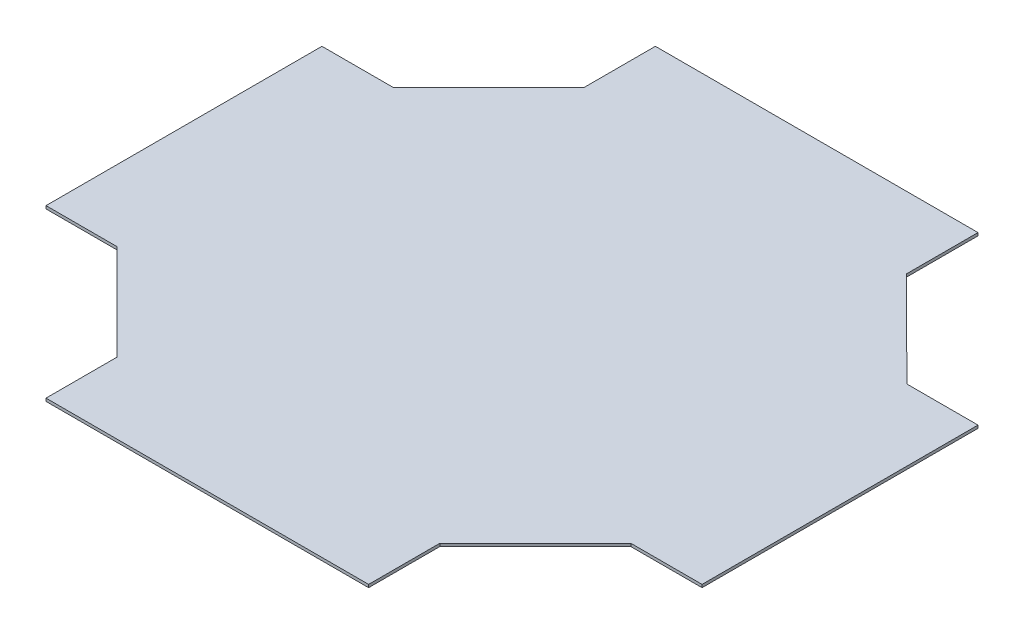
ISO-10303-21;
HEADER;
FILE_DESCRIPTION(('STEP AP214'),'2;1');
FILE_NAME('part.step','',(''),(''),'','','');
FILE_SCHEMA(('AUTOMOTIVE_DESIGN { 1 0 10303 214 1 1 1 1 }'));
ENDSEC;
DATA;
#1=APPLICATION_CONTEXT('core data for automotive mechanical design processes');
#2=APPLICATION_PROTOCOL_DEFINITION('international standard','automotive_design',2000,#1);
#3=PRODUCT_CONTEXT('',#1,'mechanical');
#4=PRODUCT('Part','Part','',(#3));
#5=PRODUCT_RELATED_PRODUCT_CATEGORY('part','',(#4));
#6=PRODUCT_DEFINITION_FORMATION('','',#4);
#7=PRODUCT_DEFINITION_CONTEXT('part definition',#1,'design');
#8=PRODUCT_DEFINITION('design','',#6,#7);
#9=PRODUCT_DEFINITION_SHAPE('','',#8);
#10=(LENGTH_UNIT() NAMED_UNIT(*) SI_UNIT(.MILLI.,.METRE.));
#11=(NAMED_UNIT(*) PLANE_ANGLE_UNIT() SI_UNIT($,.RADIAN.));
#12=(NAMED_UNIT(*) SI_UNIT($,.STERADIAN.) SOLID_ANGLE_UNIT());
#13=UNCERTAINTY_MEASURE_WITH_UNIT(LENGTH_MEASURE(1.E-05),#10,'distance_accuracy_value','');
#14=(GEOMETRIC_REPRESENTATION_CONTEXT(3) GLOBAL_UNCERTAINTY_ASSIGNED_CONTEXT((#13)) GLOBAL_UNIT_ASSIGNED_CONTEXT((#10,
#11,#12)) REPRESENTATION_CONTEXT('',''));
#15=CARTESIAN_POINT('',(0.,0.,0.));
#16=DIRECTION('',(0.,0.,1.));
#17=DIRECTION('',(1.,0.,0.));
#18=AXIS2_PLACEMENT_3D('',#15,#16,#17);
#19=CARTESIAN_POINT('',(9.12317571715341E-13,3.175,294.090177584952));
#20=DIRECTION('',(0.,0.,-1.));
#21=DIRECTION('',(-1.,0.,0.));
#22=AXIS2_PLACEMENT_3D('',#19,#20,#21);
#23=PLANE('',#22);
#24=DIRECTION('',(1.,0.,0.));
#25=VECTOR('',#24,1.);
#26=CARTESIAN_POINT('',(9.12317571715341E-13,0.,294.090177584952));
#27=LINE('',#26,#25);
#28=CARTESIAN_POINT('',(-61.1253312589233,0.,294.090177584952));
#29=VERTEX_POINT('',#28);
#30=CARTESIAN_POINT('',(295.236668741077,0.,294.090177584952));
#31=VERTEX_POINT('',#30);
#32=EDGE_CURVE('E178',#29,#31,#27,.T.);
#33=ORIENTED_EDGE('',*,*,#32,.T.);
#34=DIRECTION('',(0.,-1.,0.));
#35=VECTOR('',#34,1.);
#36=CARTESIAN_POINT('',(295.236668741077,3.175,294.090177584952));
#37=LINE('',#36,#35);
#38=CARTESIAN_POINT('',(295.236668741077,3.175,294.090177584952));
#39=VERTEX_POINT('',#38);
#40=EDGE_CURVE('E11',#39,#31,#37,.T.);
#41=ORIENTED_EDGE('',*,*,#40,.F.);
#42=DIRECTION('',(1.,0.,0.));
#43=VECTOR('',#42,1.);
#44=CARTESIAN_POINT('',(9.12317571715341E-13,3.175,294.090177584952));
#45=LINE('',#44,#43);
#46=CARTESIAN_POINT('',(-61.1253312589233,3.175,294.090177584952));
#47=VERTEX_POINT('',#46);
#48=EDGE_CURVE('E115',#47,#39,#45,.T.);
#49=ORIENTED_EDGE('',*,*,#48,.F.);
#50=DIRECTION('',(0.,-1.,0.));
#51=VECTOR('',#50,1.);
#52=CARTESIAN_POINT('',(-61.1253312589233,3.175,294.090177584952));
#53=LINE('',#52,#51);
#54=EDGE_CURVE('E174',#47,#29,#53,.T.);
#55=ORIENTED_EDGE('',*,*,#54,.T.);
#56=EDGE_LOOP('',(#33,#41,#49,#55));
#57=FACE_BOUND('',#56,.T.);
#58=ADVANCED_FACE('F35',(#57),#23,.F.);
#59=CARTESIAN_POINT('',(295.236668741077,3.175,0.));
#60=DIRECTION('',(1.,0.,0.));
#61=DIRECTION('',(0.,0.,-1.));
#62=AXIS2_PLACEMENT_3D('',#59,#60,#61);
#63=PLANE('',#62);
#64=DIRECTION('',(0.,0.,1.));
#65=VECTOR('',#64,1.);
#66=CARTESIAN_POINT('',(295.236668741077,0.,0.));
#67=LINE('',#66,#65);
#68=CARTESIAN_POINT('',(295.236668741077,0.,215.494659836284));
#69=VERTEX_POINT('',#68);
#70=EDGE_CURVE('E181',#69,#31,#67,.T.);
#71=ORIENTED_EDGE('',*,*,#70,.F.);
#72=DIRECTION('',(0.,-1.,0.));
#73=VECTOR('',#72,1.);
#74=CARTESIAN_POINT('',(295.236668741077,3.175,215.494659836284));
#75=LINE('',#74,#73);
#76=CARTESIAN_POINT('',(295.236668741077,3.175,215.494659836284));
#77=VERTEX_POINT('',#76);
#78=EDGE_CURVE('E43',#77,#69,#75,.T.);
#79=ORIENTED_EDGE('',*,*,#78,.F.);
#80=DIRECTION('',(0.,0.,1.));
#81=VECTOR('',#80,1.);
#82=CARTESIAN_POINT('',(295.236668741077,3.175,0.));
#83=LINE('',#82,#81);
#84=EDGE_CURVE('E265',#77,#39,#83,.T.);
#85=ORIENTED_EDGE('',*,*,#84,.T.);
#86=ORIENTED_EDGE('',*,*,#40,.T.);
#87=EDGE_LOOP('',(#71,#79,#85,#86));
#88=FACE_BOUND('',#87,.T.);
#89=ADVANCED_FACE('F251',(#88),#63,.T.);
#90=CARTESIAN_POINT('',(255.365664288677,3.175,255.365664288683));
#91=DIRECTION('',(0.707106781186539,0.,0.707106781186556));
#92=DIRECTION('',(0.707106781186556,0.,-0.707106781186539));
#93=AXIS2_PLACEMENT_3D('',#90,#91,#92);
#94=PLANE('',#93);
#95=DIRECTION('',(-0.707106781186556,0.,0.707106781186539));
#96=VECTOR('',#95,1.);
#97=CARTESIAN_POINT('',(255.365664288677,0.,255.365664288683));
#98=LINE('',#97,#96);
#99=CARTESIAN_POINT('',(400.791150992411,0.,109.940177584953));
#100=VERTEX_POINT('',#99);
#101=EDGE_CURVE('E184',#100,#69,#98,.T.);
#102=ORIENTED_EDGE('',*,*,#101,.F.);
#103=DIRECTION('',(0.,-1.,0.));
#104=VECTOR('',#103,1.);
#105=CARTESIAN_POINT('',(400.791150992411,3.175,109.940177584953));
#106=LINE('',#105,#104);
#107=CARTESIAN_POINT('',(400.791150992411,3.175,109.940177584953));
#108=VERTEX_POINT('',#107);
#109=EDGE_CURVE('E241',#108,#100,#106,.T.);
#110=ORIENTED_EDGE('',*,*,#109,.F.);
#111=DIRECTION('',(-0.707106781186556,0.,0.707106781186539));
#112=VECTOR('',#111,1.);
#113=CARTESIAN_POINT('',(255.365664288677,3.175,255.365664288683));
#114=LINE('',#113,#112);
#115=EDGE_CURVE('E248',#108,#77,#114,.T.);
#116=ORIENTED_EDGE('',*,*,#115,.T.);
#117=ORIENTED_EDGE('',*,*,#78,.T.);
#118=EDGE_LOOP('',(#102,#110,#116,#117));
#119=FACE_BOUND('',#118,.T.);
#120=ADVANCED_FACE('F246',(#119),#94,.T.);
#121=CARTESIAN_POINT('',(0.,3.175,109.940177584953));
#122=DIRECTION('',(0.,0.,1.));
#123=DIRECTION('',(1.,0.,0.));
#124=AXIS2_PLACEMENT_3D('',#121,#122,#123);
#125=PLANE('',#124);
#126=DIRECTION('',(-1.,0.,0.));
#127=VECTOR('',#126,1.);
#128=CARTESIAN_POINT('',(0.,0.,109.940177584953));
#129=LINE('',#128,#127);
#130=CARTESIAN_POINT('',(479.386668741076,0.,109.940177584953));
#131=VERTEX_POINT('',#130);
#132=EDGE_CURVE('E187',#131,#100,#129,.T.);
#133=ORIENTED_EDGE('',*,*,#132,.F.);
#134=DIRECTION('',(0.,-1.,0.));
#135=VECTOR('',#134,1.);
#136=CARTESIAN_POINT('',(479.386668741076,3.175,109.940177584953));
#137=LINE('',#136,#135);
#138=CARTESIAN_POINT('',(479.386668741076,3.175,109.940177584953));
#139=VERTEX_POINT('',#138);
#140=EDGE_CURVE('E239',#139,#131,#137,.T.);
#141=ORIENTED_EDGE('',*,*,#140,.F.);
#142=DIRECTION('',(-1.,0.,0.));
#143=VECTOR('',#142,1.);
#144=CARTESIAN_POINT('',(0.,3.175,109.940177584953));
#145=LINE('',#144,#143);
#146=EDGE_CURVE('E262',#139,#108,#145,.T.);
#147=ORIENTED_EDGE('',*,*,#146,.T.);
#148=ORIENTED_EDGE('',*,*,#109,.T.);
#149=EDGE_LOOP('',(#133,#141,#147,#148));
#150=FACE_BOUND('',#149,.T.);
#151=ADVANCED_FACE('F259',(#150),#125,.T.);
#152=CARTESIAN_POINT('',(479.386668741076,3.175,0.));
#153=DIRECTION('',(1.,0.,0.));
#154=DIRECTION('',(0.,0.,-1.));
#155=AXIS2_PLACEMENT_3D('',#152,#153,#154);
#156=PLANE('',#155);
#157=DIRECTION('',(0.,0.,1.));
#158=VECTOR('',#157,1.);
#159=CARTESIAN_POINT('',(479.386668741076,0.,0.));
#160=LINE('',#159,#158);
#161=CARTESIAN_POINT('',(479.386668741076,0.,-194.859822415047));
#162=VERTEX_POINT('',#161);
#163=EDGE_CURVE('E190',#162,#131,#160,.T.);
#164=ORIENTED_EDGE('',*,*,#163,.F.);
#165=DIRECTION('',(0.,-1.,0.));
#166=VECTOR('',#165,1.);
#167=CARTESIAN_POINT('',(479.386668741076,3.175,-194.859822415047));
#168=LINE('',#167,#166);
#169=CARTESIAN_POINT('',(479.386668741076,3.175,-194.859822415047));
#170=VERTEX_POINT('',#169);
#171=EDGE_CURVE('E237',#170,#162,#168,.T.);
#172=ORIENTED_EDGE('',*,*,#171,.F.);
#173=DIRECTION('',(0.,0.,1.));
#174=VECTOR('',#173,1.);
#175=CARTESIAN_POINT('',(479.386668741076,3.175,0.));
#176=LINE('',#175,#174);
#177=EDGE_CURVE('E267',#170,#139,#176,.T.);
#178=ORIENTED_EDGE('',*,*,#177,.T.);
#179=ORIENTED_EDGE('',*,*,#140,.T.);
#180=EDGE_LOOP('',(#164,#172,#178,#179));
#181=FACE_BOUND('',#180,.T.);
#182=ADVANCED_FACE('F316',(#181),#156,.T.);
#183=CARTESIAN_POINT('',(0.,3.175,-194.859822415047));
#184=DIRECTION('',(0.,0.,1.));
#185=DIRECTION('',(1.,0.,0.));
#186=AXIS2_PLACEMENT_3D('',#183,#184,#185);
#187=PLANE('',#186);
#188=DIRECTION('',(-1.,0.,0.));
#189=VECTOR('',#188,1.);
#190=CARTESIAN_POINT('',(0.,0.,-194.859822415047));
#191=LINE('',#190,#189);
#192=CARTESIAN_POINT('',(400.791150992411,0.,-194.859822415047));
#193=VERTEX_POINT('',#192);
#194=EDGE_CURVE('E193',#162,#193,#191,.T.);
#195=ORIENTED_EDGE('',*,*,#194,.T.);
#196=DIRECTION('',(0.,-1.,0.));
#197=VECTOR('',#196,1.);
#198=CARTESIAN_POINT('',(400.791150992411,3.175,-194.859822415047));
#199=LINE('',#198,#197);
#200=CARTESIAN_POINT('',(400.791150992411,3.175,-194.859822415047));
#201=VERTEX_POINT('',#200);
#202=EDGE_CURVE('E234',#201,#193,#199,.T.);
#203=ORIENTED_EDGE('',*,*,#202,.F.);
#204=DIRECTION('',(-1.,0.,0.));
#205=VECTOR('',#204,1.);
#206=CARTESIAN_POINT('',(0.,3.175,-194.859822415047));
#207=LINE('',#206,#205);
#208=EDGE_CURVE('E273',#170,#201,#207,.T.);
#209=ORIENTED_EDGE('',*,*,#208,.F.);
#210=ORIENTED_EDGE('',*,*,#171,.T.);
#211=EDGE_LOOP('',(#195,#203,#209,#210));
#212=FACE_BOUND('',#211,.T.);
#213=ADVANCED_FACE('F319',(#212),#187,.F.);
#214=CARTESIAN_POINT('',(297.136560815048,3.175,-298.158972471459));
#215=DIRECTION('',(-0.705891294190375,0.,0.708320182393695));
#216=DIRECTION('',(0.708320182393695,0.,0.705891294190375));
#217=AXIS2_PLACEMENT_3D('',#214,#215,#216);
#218=PLANE('',#217);
#219=DIRECTION('',(-0.708320182393695,0.,-0.705891294190375));
#220=VECTOR('',#219,1.);
#221=CARTESIAN_POINT('',(297.136560815048,0.,-298.158972471459));
#222=LINE('',#221,#220);
#223=CARTESIAN_POINT('',(295.236668741077,0.,-300.052349659139));
#224=VERTEX_POINT('',#223);
#225=EDGE_CURVE('E195',#193,#224,#222,.T.);
#226=ORIENTED_EDGE('',*,*,#225,.T.);
#227=DIRECTION('',(0.,-1.,0.));
#228=VECTOR('',#227,1.);
#229=CARTESIAN_POINT('',(295.236668741077,3.175,-300.052349659139));
#230=LINE('',#229,#228);
#231=CARTESIAN_POINT('',(295.236668741077,3.175,-300.052349659139));
#232=VERTEX_POINT('',#231);
#233=EDGE_CURVE('E232',#232,#224,#230,.T.);
#234=ORIENTED_EDGE('',*,*,#233,.F.);
#235=DIRECTION('',(-0.708320182393695,0.,-0.705891294190375));
#236=VECTOR('',#235,1.);
#237=CARTESIAN_POINT('',(297.136560815048,3.175,-298.158972471459));
#238=LINE('',#237,#236);
#239=EDGE_CURVE('E275',#201,#232,#238,.T.);
#240=ORIENTED_EDGE('',*,*,#239,.F.);
#241=ORIENTED_EDGE('',*,*,#202,.T.);
#242=EDGE_LOOP('',(#226,#234,#240,#241));
#243=FACE_BOUND('',#242,.T.);
#244=ADVANCED_FACE('F323',(#243),#218,.F.);
#245=CARTESIAN_POINT('',(295.236668741077,3.175,0.));
#246=DIRECTION('',(1.,0.,0.));
#247=DIRECTION('',(0.,0.,-1.));
#248=AXIS2_PLACEMENT_3D('',#245,#246,#247);
#249=PLANE('',#248);
#250=DIRECTION('',(0.,0.,1.));
#251=VECTOR('',#250,1.);
#252=CARTESIAN_POINT('',(295.236668741077,0.,0.));
#253=LINE('',#252,#251);
#254=CARTESIAN_POINT('',(295.236668741077,0.,-379.009822415047));
#255=VERTEX_POINT('',#254);
#256=EDGE_CURVE('E198',#255,#224,#253,.T.);
#257=ORIENTED_EDGE('',*,*,#256,.F.);
#258=DIRECTION('',(0.,-1.,0.));
#259=VECTOR('',#258,1.);
#260=CARTESIAN_POINT('',(295.236668741077,3.175,-379.009822415047));
#261=LINE('',#260,#259);
#262=CARTESIAN_POINT('',(295.236668741077,3.175,-379.009822415047));
#263=VERTEX_POINT('',#262);
#264=EDGE_CURVE('E230',#263,#255,#261,.T.);
#265=ORIENTED_EDGE('',*,*,#264,.F.);
#266=DIRECTION('',(0.,0.,1.));
#267=VECTOR('',#266,1.);
#268=CARTESIAN_POINT('',(295.236668741077,3.175,0.));
#269=LINE('',#268,#267);
#270=EDGE_CURVE('E277',#263,#232,#269,.T.);
#271=ORIENTED_EDGE('',*,*,#270,.T.);
#272=ORIENTED_EDGE('',*,*,#233,.T.);
#273=EDGE_LOOP('',(#257,#265,#271,#272));
#274=FACE_BOUND('',#273,.T.);
#275=ADVANCED_FACE('F327',(#274),#249,.T.);
#276=CARTESIAN_POINT('',(0.,3.175,-379.009822415047));
#277=DIRECTION('',(0.,0.,-1.));
#278=DIRECTION('',(-1.,0.,0.));
#279=AXIS2_PLACEMENT_3D('',#276,#277,#278);
#280=PLANE('',#279);
#281=DIRECTION('',(1.,0.,0.));
#282=VECTOR('',#281,1.);
#283=CARTESIAN_POINT('',(0.,0.,-379.009822415047));
#284=LINE('',#283,#282);
#285=CARTESIAN_POINT('',(-61.1253312589233,0.,-379.009822415047));
#286=VERTEX_POINT('',#285);
#287=EDGE_CURVE('E201',#286,#255,#284,.T.);
#288=ORIENTED_EDGE('',*,*,#287,.F.);
#289=DIRECTION('',(0.,-1.,0.));
#290=VECTOR('',#289,1.);
#291=CARTESIAN_POINT('',(-61.1253312589233,3.175,-379.009822415047));
#292=LINE('',#291,#290);
#293=CARTESIAN_POINT('',(-61.1253312589233,3.175,-379.009822415047));
#294=VERTEX_POINT('',#293);
#295=EDGE_CURVE('E228',#294,#286,#292,.T.);
#296=ORIENTED_EDGE('',*,*,#295,.F.);
#297=DIRECTION('',(1.,0.,0.));
#298=VECTOR('',#297,1.);
#299=CARTESIAN_POINT('',(0.,3.175,-379.009822415047));
#300=LINE('',#299,#298);
#301=EDGE_CURVE('E280',#294,#263,#300,.T.);
#302=ORIENTED_EDGE('',*,*,#301,.T.);
#303=ORIENTED_EDGE('',*,*,#264,.T.);
#304=EDGE_LOOP('',(#288,#296,#302,#303));
#305=FACE_BOUND('',#304,.T.);
#306=ADVANCED_FACE('F331',(#305),#280,.T.);
#307=CARTESIAN_POINT('',(-61.1253312589233,3.175,0.));
#308=DIRECTION('',(1.,0.,0.));
#309=DIRECTION('',(0.,0.,-1.));
#310=AXIS2_PLACEMENT_3D('',#307,#308,#309);
#311=PLANE('',#310);
#312=DIRECTION('',(0.,0.,1.));
#313=VECTOR('',#312,1.);
#314=CARTESIAN_POINT('',(-61.1253312589233,0.,0.));
#315=LINE('',#314,#313);
#316=CARTESIAN_POINT('',(-61.1253312589233,0.,-300.052349659139));
#317=VERTEX_POINT('',#316);
#318=EDGE_CURVE('E204',#286,#317,#315,.T.);
#319=ORIENTED_EDGE('',*,*,#318,.T.);
#320=DIRECTION('',(0.,-1.,0.));
#321=VECTOR('',#320,1.);
#322=CARTESIAN_POINT('',(-61.1253312589233,3.175,-300.052349659139));
#323=LINE('',#322,#321);
#324=CARTESIAN_POINT('',(-61.1253312589233,3.175,-300.052349659139));
#325=VERTEX_POINT('',#324);
#326=EDGE_CURVE('E226',#325,#317,#323,.T.);
#327=ORIENTED_EDGE('',*,*,#326,.F.);
#328=DIRECTION('',(0.,0.,1.));
#329=VECTOR('',#328,1.);
#330=CARTESIAN_POINT('',(-61.1253312589233,3.175,0.));
#331=LINE('',#330,#329);
#332=EDGE_CURVE('E283',#294,#325,#331,.T.);
#333=ORIENTED_EDGE('',*,*,#332,.F.);
#334=ORIENTED_EDGE('',*,*,#295,.T.);
#335=EDGE_LOOP('',(#319,#327,#333,#334));
#336=FACE_BOUND('',#335,.T.);
#337=ADVANCED_FACE('F335',(#336),#311,.F.);
#338=CARTESIAN_POINT('',(-180.482973797938,3.175,-181.103994300054));
#339=DIRECTION('',(-0.705891294190375,0.,-0.708320182393695));
#340=DIRECTION('',(-0.708320182393695,0.,0.705891294190375));
#341=AXIS2_PLACEMENT_3D('',#338,#339,#340);
#342=PLANE('',#341);
#343=DIRECTION('',(0.708320182393695,0.,-0.705891294190375));
#344=VECTOR('',#343,1.);
#345=CARTESIAN_POINT('',(-180.482973797938,0.,-181.103994300054));
#346=LINE('',#345,#344);
#347=CARTESIAN_POINT('',(-166.679813510257,0.,-194.859822415047));
#348=VERTEX_POINT('',#347);
#349=EDGE_CURVE('E207',#348,#317,#346,.T.);
#350=ORIENTED_EDGE('',*,*,#349,.F.);
#351=DIRECTION('',(0.,-1.,0.));
#352=VECTOR('',#351,1.);
#353=CARTESIAN_POINT('',(-166.679813510257,3.175,-194.859822415047));
#354=LINE('',#353,#352);
#355=CARTESIAN_POINT('',(-166.679813510257,3.175,-194.859822415047));
#356=VERTEX_POINT('',#355);
#357=EDGE_CURVE('E224',#356,#348,#354,.T.);
#358=ORIENTED_EDGE('',*,*,#357,.F.);
#359=DIRECTION('',(0.708320182393695,0.,-0.705891294190375));
#360=VECTOR('',#359,1.);
#361=CARTESIAN_POINT('',(-180.482973797938,3.175,-181.103994300054));
#362=LINE('',#361,#360);
#363=EDGE_CURVE('E285',#356,#325,#362,.T.);
#364=ORIENTED_EDGE('',*,*,#363,.T.);
#365=ORIENTED_EDGE('',*,*,#326,.T.);
#366=EDGE_LOOP('',(#350,#358,#364,#365));
#367=FACE_BOUND('',#366,.T.);
#368=ADVANCED_FACE('F339',(#367),#342,.T.);
#369=CARTESIAN_POINT('',(0.,3.175,-194.859822415047));
#370=DIRECTION('',(0.,0.,-1.));
#371=DIRECTION('',(-1.,0.,0.));
#372=AXIS2_PLACEMENT_3D('',#369,#370,#371);
#373=PLANE('',#372);
#374=DIRECTION('',(1.,0.,0.));
#375=VECTOR('',#374,1.);
#376=CARTESIAN_POINT('',(0.,0.,-194.859822415047));
#377=LINE('',#376,#375);
#378=CARTESIAN_POINT('',(-245.275331258923,0.,-194.859822415047));
#379=VERTEX_POINT('',#378);
#380=EDGE_CURVE('E210',#379,#348,#377,.T.);
#381=ORIENTED_EDGE('',*,*,#380,.F.);
#382=DIRECTION('',(0.,-1.,0.));
#383=VECTOR('',#382,1.);
#384=CARTESIAN_POINT('',(-245.275331258923,3.175,-194.859822415047));
#385=LINE('',#384,#383);
#386=CARTESIAN_POINT('',(-245.275331258923,3.175,-194.859822415047));
#387=VERTEX_POINT('',#386);
#388=EDGE_CURVE('E222',#387,#379,#385,.T.);
#389=ORIENTED_EDGE('',*,*,#388,.F.);
#390=DIRECTION('',(1.,0.,0.));
#391=VECTOR('',#390,1.);
#392=CARTESIAN_POINT('',(0.,3.175,-194.859822415047));
#393=LINE('',#392,#391);
#394=EDGE_CURVE('E288',#387,#356,#393,.T.);
#395=ORIENTED_EDGE('',*,*,#394,.T.);
#396=ORIENTED_EDGE('',*,*,#357,.T.);
#397=EDGE_LOOP('',(#381,#389,#395,#396));
#398=FACE_BOUND('',#397,.T.);
#399=ADVANCED_FACE('F343',(#398),#373,.T.);
#400=CARTESIAN_POINT('',(-245.275331258923,3.175,0.));
#401=DIRECTION('',(-1.,0.,0.));
#402=DIRECTION('',(0.,0.,1.));
#403=AXIS2_PLACEMENT_3D('',#400,#401,#402);
#404=PLANE('',#403);
#405=DIRECTION('',(0.,0.,-1.));
#406=VECTOR('',#405,1.);
#407=CARTESIAN_POINT('',(-245.275331258923,0.,0.));
#408=LINE('',#407,#406);
#409=CARTESIAN_POINT('',(-245.275331258923,0.,109.940177584953));
#410=VERTEX_POINT('',#409);
#411=EDGE_CURVE('E213',#410,#379,#408,.T.);
#412=ORIENTED_EDGE('',*,*,#411,.F.);
#413=DIRECTION('',(0.,-1.,0.));
#414=VECTOR('',#413,1.);
#415=CARTESIAN_POINT('',(-245.275331258923,3.175,109.940177584953));
#416=LINE('',#415,#414);
#417=CARTESIAN_POINT('',(-245.275331258923,3.175,109.940177584953));
#418=VERTEX_POINT('',#417);
#419=EDGE_CURVE('E169',#418,#410,#416,.T.);
#420=ORIENTED_EDGE('',*,*,#419,.F.);
#421=DIRECTION('',(0.,0.,-1.));
#422=VECTOR('',#421,1.);
#423=CARTESIAN_POINT('',(-245.275331258923,3.175,0.));
#424=LINE('',#423,#422);
#425=EDGE_CURVE('E162',#418,#387,#424,.T.);
#426=ORIENTED_EDGE('',*,*,#425,.T.);
#427=ORIENTED_EDGE('',*,*,#388,.T.);
#428=EDGE_LOOP('',(#412,#420,#426,#427));
#429=FACE_BOUND('',#428,.T.);
#430=ADVANCED_FACE('F292',(#429),#404,.T.);
#431=CARTESIAN_POINT('',(0.,3.175,109.940177584953));
#432=DIRECTION('',(0.,0.,-1.));
#433=DIRECTION('',(-1.,0.,0.));
#434=AXIS2_PLACEMENT_3D('',#431,#432,#433);
#435=PLANE('',#434);
#436=DIRECTION('',(1.,0.,0.));
#437=VECTOR('',#436,1.);
#438=CARTESIAN_POINT('',(0.,0.,109.940177584953));
#439=LINE('',#438,#437);
#440=CARTESIAN_POINT('',(-166.679813510257,0.,109.940177584953));
#441=VERTEX_POINT('',#440);
#442=EDGE_CURVE('E168',#410,#441,#439,.T.);
#443=ORIENTED_EDGE('',*,*,#442,.T.);
#444=DIRECTION('',(0.,-1.,0.));
#445=VECTOR('',#444,1.);
#446=CARTESIAN_POINT('',(-166.679813510257,3.175,109.940177584953));
#447=LINE('',#446,#445);
#448=CARTESIAN_POINT('',(-166.679813510257,3.175,109.940177584953));
#449=VERTEX_POINT('',#448);
#450=EDGE_CURVE('E165',#449,#441,#447,.T.);
#451=ORIENTED_EDGE('',*,*,#450,.F.);
#452=DIRECTION('',(1.,0.,0.));
#453=VECTOR('',#452,1.);
#454=CARTESIAN_POINT('',(0.,3.175,109.940177584953));
#455=LINE('',#454,#453);
#456=EDGE_CURVE('E155',#418,#449,#455,.T.);
#457=ORIENTED_EDGE('',*,*,#456,.F.);
#458=ORIENTED_EDGE('',*,*,#419,.T.);
#459=EDGE_LOOP('',(#443,#451,#457,#458));
#460=FACE_BOUND('',#459,.T.);
#461=ADVANCED_FACE('F166',(#460),#435,.F.);
#462=CARTESIAN_POINT('',(-138.309995547603,3.175,138.309995547607));
#463=DIRECTION('',(0.707106781186539,0.,-0.707106781186556));
#464=DIRECTION('',(-0.707106781186556,0.,-0.707106781186539));
#465=AXIS2_PLACEMENT_3D('',#462,#463,#464);
#466=PLANE('',#465);
#467=DIRECTION('',(0.707106781186556,0.,0.707106781186539));
#468=VECTOR('',#467,1.);
#469=CARTESIAN_POINT('',(-138.309995547603,0.,138.309995547607));
#470=LINE('',#469,#468);
#471=CARTESIAN_POINT('',(-61.1253312589233,0.,215.494659836284));
#472=VERTEX_POINT('',#471);
#473=EDGE_CURVE('E103',#441,#472,#470,.T.);
#474=ORIENTED_EDGE('',*,*,#473,.T.);
#475=DIRECTION('',(0.,-1.,0.));
#476=VECTOR('',#475,1.);
#477=CARTESIAN_POINT('',(-61.1253312589233,3.175,215.494659836284));
#478=LINE('',#477,#476);
#479=CARTESIAN_POINT('',(-61.1253312589233,3.175,215.494659836284));
#480=VERTEX_POINT('',#479);
#481=EDGE_CURVE('E170',#480,#472,#478,.T.);
#482=ORIENTED_EDGE('',*,*,#481,.F.);
#483=DIRECTION('',(0.707106781186556,0.,0.707106781186539));
#484=VECTOR('',#483,1.);
#485=CARTESIAN_POINT('',(-138.309995547603,3.175,138.309995547607));
#486=LINE('',#485,#484);
#487=EDGE_CURVE('E159',#449,#480,#486,.T.);
#488=ORIENTED_EDGE('',*,*,#487,.F.);
#489=ORIENTED_EDGE('',*,*,#450,.T.);
#490=EDGE_LOOP('',(#474,#482,#488,#489));
#491=FACE_BOUND('',#490,.T.);
#492=ADVANCED_FACE('F172',(#491),#466,.F.);
#493=CARTESIAN_POINT('',(-61.1253312589233,3.175,0.));
#494=DIRECTION('',(1.,0.,0.));
#495=DIRECTION('',(0.,0.,-1.));
#496=AXIS2_PLACEMENT_3D('',#493,#494,#495);
#497=PLANE('',#496);
#498=DIRECTION('',(0.,0.,1.));
#499=VECTOR('',#498,1.);
#500=CARTESIAN_POINT('',(-61.1253312589233,0.,0.));
#501=LINE('',#500,#499);
#502=EDGE_CURVE('E109',#472,#29,#501,.T.);
#503=ORIENTED_EDGE('',*,*,#502,.T.);
#504=ORIENTED_EDGE('',*,*,#54,.F.);
#505=DIRECTION('',(0.,0.,1.));
#506=VECTOR('',#505,1.);
#507=CARTESIAN_POINT('',(-61.1253312589233,3.175,0.));
#508=LINE('',#507,#506);
#509=EDGE_CURVE('E51',#480,#47,#508,.T.);
#510=ORIENTED_EDGE('',*,*,#509,.F.);
#511=ORIENTED_EDGE('',*,*,#481,.T.);
#512=EDGE_LOOP('',(#503,#504,#510,#511));
#513=FACE_BOUND('',#512,.T.);
#514=ADVANCED_FACE('F295',(#513),#497,.F.);
#515=CARTESIAN_POINT('',(0.,3.175,0.));
#516=DIRECTION('',(0.,1.,0.));
#517=DIRECTION('',(0.,0.,1.));
#518=AXIS2_PLACEMENT_3D('',#515,#516,#517);
#519=PLANE('',#518);
#520=ORIENTED_EDGE('',*,*,#48,.T.);
#521=ORIENTED_EDGE('',*,*,#84,.F.);
#522=ORIENTED_EDGE('',*,*,#115,.F.);
#523=ORIENTED_EDGE('',*,*,#146,.F.);
#524=ORIENTED_EDGE('',*,*,#177,.F.);
#525=ORIENTED_EDGE('',*,*,#208,.T.);
#526=ORIENTED_EDGE('',*,*,#239,.T.);
#527=ORIENTED_EDGE('',*,*,#270,.F.);
#528=ORIENTED_EDGE('',*,*,#301,.F.);
#529=ORIENTED_EDGE('',*,*,#332,.T.);
#530=ORIENTED_EDGE('',*,*,#363,.F.);
#531=ORIENTED_EDGE('',*,*,#394,.F.);
#532=ORIENTED_EDGE('',*,*,#425,.F.);
#533=ORIENTED_EDGE('',*,*,#456,.T.);
#534=ORIENTED_EDGE('',*,*,#487,.T.);
#535=ORIENTED_EDGE('',*,*,#509,.T.);
#536=EDGE_LOOP('',(#520,#521,#522,#523,#524,#525,#526,#527,#528,#529,#530,#531,#532,#533,#534,#535));
#537=FACE_BOUND('',#536,.T.);
#538=ADVANCED_FACE('F157',(#537),#519,.T.);
#539=CARTESIAN_POINT('',(0.,0.,0.));
#540=DIRECTION('',(0.,1.,0.));
#541=DIRECTION('',(0.,0.,1.));
#542=AXIS2_PLACEMENT_3D('',#539,#540,#541);
#543=PLANE('',#542);
#544=ORIENTED_EDGE('',*,*,#32,.F.);
#545=ORIENTED_EDGE('',*,*,#502,.F.);
#546=ORIENTED_EDGE('',*,*,#473,.F.);
#547=ORIENTED_EDGE('',*,*,#442,.F.);
#548=ORIENTED_EDGE('',*,*,#411,.T.);
#549=ORIENTED_EDGE('',*,*,#380,.T.);
#550=ORIENTED_EDGE('',*,*,#349,.T.);
#551=ORIENTED_EDGE('',*,*,#318,.F.);
#552=ORIENTED_EDGE('',*,*,#287,.T.);
#553=ORIENTED_EDGE('',*,*,#256,.T.);
#554=ORIENTED_EDGE('',*,*,#225,.F.);
#555=ORIENTED_EDGE('',*,*,#194,.F.);
#556=ORIENTED_EDGE('',*,*,#163,.T.);
#557=ORIENTED_EDGE('',*,*,#132,.T.);
#558=ORIENTED_EDGE('',*,*,#101,.T.);
#559=ORIENTED_EDGE('',*,*,#70,.T.);
#560=EDGE_LOOP('',(#544,#545,#546,#547,#548,#549,#550,#551,#552,#553,#554,#555,#556,#557,#558,#559));
#561=FACE_BOUND('',#560,.T.);
#562=ADVANCED_FACE('F254',(#561),#543,.F.);
#563=CLOSED_SHELL('',(#58,#89,#120,#151,#182,#213,#244,#275,#306,#337,#368,#399,#430,#461,#492,
#514,#538,#562));
#564=MANIFOLD_SOLID_BREP('B2',#563);
#565=ADVANCED_BREP_SHAPE_REPRESENTATION('',(#18,#564),#14);
#566=SHAPE_DEFINITION_REPRESENTATION(#9,#565);
ENDSEC;
END-ISO-10303-21;
